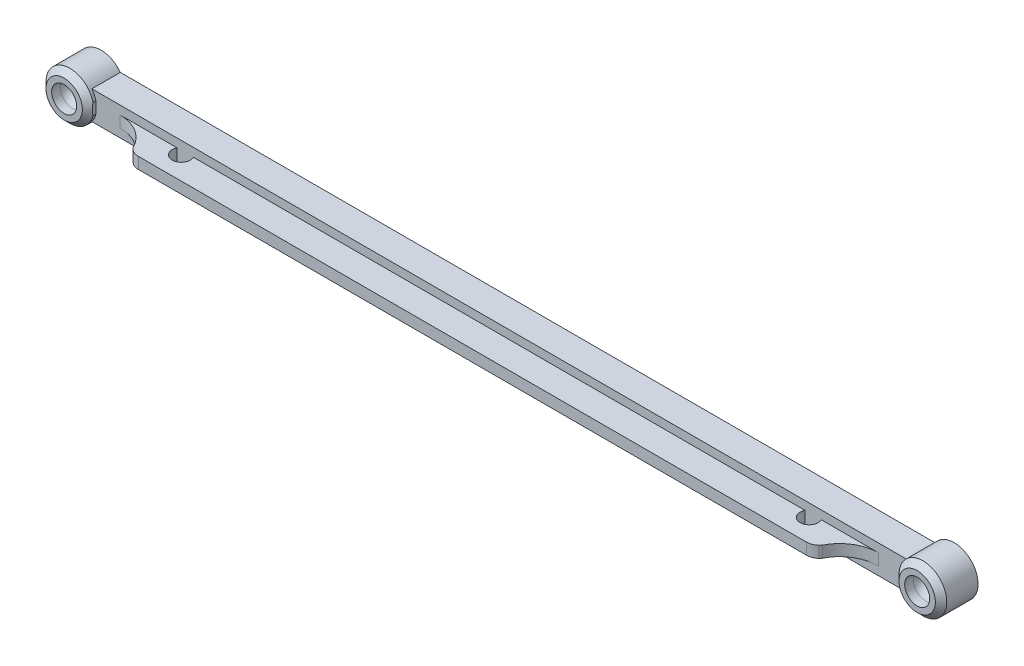
ISO-10303-21;
HEADER;
FILE_DESCRIPTION(('STEP AP214'),'2;1');
FILE_NAME('part.step','',(''),(''),'','','');
FILE_SCHEMA(('AUTOMOTIVE_DESIGN { 1 0 10303 214 1 1 1 1 }'));
ENDSEC;
DATA;
#1=APPLICATION_CONTEXT('core data for automotive mechanical design processes');
#2=APPLICATION_PROTOCOL_DEFINITION('international standard','automotive_design',2000,#1);
#3=PRODUCT_CONTEXT('',#1,'mechanical');
#4=PRODUCT('Part','Part','',(#3));
#5=PRODUCT_RELATED_PRODUCT_CATEGORY('part','',(#4));
#6=PRODUCT_DEFINITION_FORMATION('','',#4);
#7=PRODUCT_DEFINITION_CONTEXT('part definition',#1,'design');
#8=PRODUCT_DEFINITION('design','',#6,#7);
#9=PRODUCT_DEFINITION_SHAPE('','',#8);
#10=(LENGTH_UNIT() NAMED_UNIT(*) SI_UNIT(.MILLI.,.METRE.));
#11=(NAMED_UNIT(*) PLANE_ANGLE_UNIT() SI_UNIT($,.RADIAN.));
#12=(NAMED_UNIT(*) SI_UNIT($,.STERADIAN.) SOLID_ANGLE_UNIT());
#13=UNCERTAINTY_MEASURE_WITH_UNIT(LENGTH_MEASURE(1.E-05),#10,'distance_accuracy_value','');
#14=(GEOMETRIC_REPRESENTATION_CONTEXT(3) GLOBAL_UNCERTAINTY_ASSIGNED_CONTEXT((#13)) GLOBAL_UNIT_ASSIGNED_CONTEXT((#10,
#11,#12)) REPRESENTATION_CONTEXT('',''));
#15=CARTESIAN_POINT('',(0.,0.,0.));
#16=DIRECTION('',(0.,0.,1.));
#17=DIRECTION('',(1.,0.,0.));
#18=AXIS2_PLACEMENT_3D('',#15,#16,#17);
#19=CARTESIAN_POINT('',(154.201,3.5,5.));
#20=DIRECTION('',(0.,-1.,0.));
#21=DIRECTION('',(0.,0.,-1.));
#22=AXIS2_PLACEMENT_3D('',#19,#20,#21);
#23=PLANE('',#22);
#24=DIRECTION('',(-1.,0.,0.));
#25=VECTOR('',#24,1.);
#26=CARTESIAN_POINT('',(154.201,3.5,5.));
#27=LINE('',#26,#25);
#28=CARTESIAN_POINT('',(141.68959214773,3.5,5.));
#29=VERTEX_POINT('',#28);
#30=CARTESIAN_POINT('',(131.644,3.5,5.));
#31=VERTEX_POINT('',#30);
#32=EDGE_CURVE('E214',#29,#31,#27,.T.);
#33=ORIENTED_EDGE('',*,*,#32,.T.);
#34=CARTESIAN_POINT('',(130.2055,3.5,5.70051249096644));
#35=DIRECTION('',(0.,-1.,0.));
#36=DIRECTION('',(0.,0.,-1.));
#37=AXIS2_PLACEMENT_3D('',#34,#35,#36);
#38=CIRCLE('',#37,1.60000000000001);
#39=CARTESIAN_POINT('',(128.767,3.5,5.));
#40=VERTEX_POINT('',#39);
#41=EDGE_CURVE('E176',#31,#40,#38,.T.);
#42=ORIENTED_EDGE('',*,*,#41,.T.);
#43=CARTESIAN_POINT('',(21.233,3.5,5.));
#44=VERTEX_POINT('',#43);
#45=EDGE_CURVE('E238',#40,#44,#27,.T.);
#46=ORIENTED_EDGE('',*,*,#45,.T.);
#47=CARTESIAN_POINT('',(19.7945,3.5,5.70051249096644));
#48=DIRECTION('',(0.,-1.,0.));
#49=DIRECTION('',(0.,0.,-1.));
#50=AXIS2_PLACEMENT_3D('',#47,#48,#49);
#51=CIRCLE('',#50,1.6);
#52=CARTESIAN_POINT('',(18.356,3.5,5.));
#53=VERTEX_POINT('',#52);
#54=EDGE_CURVE('E444',#53,#44,#51,.F.);
#55=ORIENTED_EDGE('',*,*,#54,.F.);
#56=CARTESIAN_POINT('',(8.3104078522698,3.5,5.));
#57=VERTEX_POINT('',#56);
#58=EDGE_CURVE('E239',#53,#57,#27,.T.);
#59=ORIENTED_EDGE('',*,*,#58,.T.);
#60=CARTESIAN_POINT('',(8.3104078522698,3.5,11.8208559757819));
#61=DIRECTION('',(0.,-1.,0.));
#62=DIRECTION('',(0.,0.,-1.));
#63=AXIS2_PLACEMENT_3D('',#60,#61,#62);
#64=CIRCLE('',#63,6.82085597578193);
#65=CARTESIAN_POINT('',(14.4321261282648,3.5,8.81275996805392));
#66=VERTEX_POINT('',#65);
#67=EDGE_CURVE('E296',#57,#66,#64,.T.);
#68=ORIENTED_EDGE('',*,*,#67,.T.);
#69=DIRECTION('',(-0.678416162135093,0.,-0.734677827999383));
#70=VECTOR('',#69,1.);
#71=CARTESIAN_POINT('',(76.8601935670094,3.49999999999999,76.4180434974916));
#72=LINE('',#71,#70);
#73=CARTESIAN_POINT('',(14.6695717850121,3.5,9.06989720785372));
#74=VERTEX_POINT('',#73);
#75=EDGE_CURVE('E294',#74,#66,#72,.T.);
#76=ORIENTED_EDGE('',*,*,#75,.F.);
#77=CARTESIAN_POINT('',(16.27,3.5,7.35244652390528));
#78=DIRECTION('',(0.,-1.,0.));
#79=DIRECTION('',(0.,0.,-1.));
#80=AXIS2_PLACEMENT_3D('',#77,#78,#79);
#81=CIRCLE('',#80,2.34755347609473);
#82=CARTESIAN_POINT('',(16.27,3.5,9.7));
#83=VERTEX_POINT('',#82);
#84=EDGE_CURVE('E292',#83,#74,#81,.T.);
#85=ORIENTED_EDGE('',*,*,#84,.F.);
#86=DIRECTION('',(-1.,0.,0.));
#87=VECTOR('',#86,1.);
#88=CARTESIAN_POINT('',(154.201,3.5,9.7));
#89=LINE('',#88,#87);
#90=CARTESIAN_POINT('',(133.73,3.5,9.7));
#91=VERTEX_POINT('',#90);
#92=EDGE_CURVE('E208',#91,#83,#89,.T.);
#93=ORIENTED_EDGE('',*,*,#92,.F.);
#94=CARTESIAN_POINT('',(133.73,3.5,7.35244652390528));
#95=DIRECTION('',(0.,-1.,0.));
#96=DIRECTION('',(0.,0.,-1.));
#97=AXIS2_PLACEMENT_3D('',#94,#95,#96);
#98=CIRCLE('',#97,2.34755347609473);
#99=CARTESIAN_POINT('',(135.330428214988,3.5,9.06989720785372));
#100=VERTEX_POINT('',#99);
#101=EDGE_CURVE('E426',#91,#100,#98,.F.);
#102=ORIENTED_EDGE('',*,*,#101,.T.);
#103=DIRECTION('',(0.678416162135093,0.,-0.734677827999383));
#104=VECTOR('',#103,1.);
#105=CARTESIAN_POINT('',(146.044087594872,3.5,-2.53225563350403));
#106=LINE('',#105,#104);
#107=CARTESIAN_POINT('',(135.567873871735,3.5,8.81275996805392));
#108=VERTEX_POINT('',#107);
#109=EDGE_CURVE('E419',#100,#108,#106,.T.);
#110=ORIENTED_EDGE('',*,*,#109,.T.);
#111=CARTESIAN_POINT('',(141.68959214773,3.5,11.8208559757819));
#112=DIRECTION('',(0.,-1.,0.));
#113=DIRECTION('',(0.,0.,-1.));
#114=AXIS2_PLACEMENT_3D('',#111,#112,#113);
#115=CIRCLE('',#114,6.82085597578194);
#116=EDGE_CURVE('E424',#29,#108,#115,.F.);
#117=ORIENTED_EDGE('',*,*,#116,.F.);
#118=EDGE_LOOP('',(#33,#42,#46,#55,#59,#68,#76,#85,#93,#102,#110,#117));
#119=FACE_BOUND('',#118,.T.);
#120=ADVANCED_FACE('F35',(#119),#23,.F.);
#121=CARTESIAN_POINT('',(154.201,1.5,5.));
#122=DIRECTION('',(0.,1.,0.));
#123=DIRECTION('',(0.,0.,1.));
#124=AXIS2_PLACEMENT_3D('',#121,#122,#123);
#125=PLANE('',#124);
#126=DIRECTION('',(-1.,0.,0.));
#127=VECTOR('',#126,1.);
#128=CARTESIAN_POINT('',(154.201,1.5,5.));
#129=LINE('',#128,#127);
#130=CARTESIAN_POINT('',(128.767,1.5,5.));
#131=VERTEX_POINT('',#130);
#132=CARTESIAN_POINT('',(21.233,1.5,5.));
#133=VERTEX_POINT('',#132);
#134=EDGE_CURVE('E189',#131,#133,#129,.T.);
#135=ORIENTED_EDGE('',*,*,#134,.F.);
#136=CARTESIAN_POINT('',(130.2055,1.5,5.70051249096644));
#137=DIRECTION('',(0.,-1.,0.));
#138=DIRECTION('',(0.,0.,-1.));
#139=AXIS2_PLACEMENT_3D('',#136,#137,#138);
#140=CIRCLE('',#139,1.60000000000001);
#141=CARTESIAN_POINT('',(131.644,1.5,5.));
#142=VERTEX_POINT('',#141);
#143=EDGE_CURVE('E50',#142,#131,#140,.T.);
#144=ORIENTED_EDGE('',*,*,#143,.F.);
#145=CARTESIAN_POINT('',(141.68959214773,1.5,5.));
#146=VERTEX_POINT('',#145);
#147=EDGE_CURVE('E187',#146,#142,#129,.T.);
#148=ORIENTED_EDGE('',*,*,#147,.F.);
#149=CARTESIAN_POINT('',(141.68959214773,1.5,11.8208559757819));
#150=DIRECTION('',(0.,-1.,0.));
#151=DIRECTION('',(0.,0.,-1.));
#152=AXIS2_PLACEMENT_3D('',#149,#150,#151);
#153=CIRCLE('',#152,6.82085597578194);
#154=CARTESIAN_POINT('',(135.567873871735,1.5,8.81275996805392));
#155=VERTEX_POINT('',#154);
#156=EDGE_CURVE('E442',#146,#155,#153,.F.);
#157=ORIENTED_EDGE('',*,*,#156,.T.);
#158=DIRECTION('',(0.678416162135093,0.,-0.734677827999383));
#159=VECTOR('',#158,1.);
#160=CARTESIAN_POINT('',(77.5653968978587,1.49999999999999,71.6254348130059));
#161=LINE('',#160,#159);
#162=CARTESIAN_POINT('',(135.330428214988,1.5,9.06989720785371));
#163=VERTEX_POINT('',#162);
#164=EDGE_CURVE('E432',#163,#155,#161,.T.);
#165=ORIENTED_EDGE('',*,*,#164,.F.);
#166=CARTESIAN_POINT('',(133.73,1.5,7.35244652390528));
#167=DIRECTION('',(0.,-1.,0.));
#168=DIRECTION('',(0.,0.,-1.));
#169=AXIS2_PLACEMENT_3D('',#166,#167,#168);
#170=CIRCLE('',#169,2.34755347609473);
#171=CARTESIAN_POINT('',(133.73,1.5,9.7));
#172=VERTEX_POINT('',#171);
#173=EDGE_CURVE('E439',#172,#163,#170,.F.);
#174=ORIENTED_EDGE('',*,*,#173,.F.);
#175=DIRECTION('',(-1.,0.,0.));
#176=VECTOR('',#175,1.);
#177=CARTESIAN_POINT('',(154.201,1.5,9.7));
#178=LINE('',#177,#176);
#179=CARTESIAN_POINT('',(16.27,1.5,9.7));
#180=VERTEX_POINT('',#179);
#181=EDGE_CURVE('E203',#172,#180,#178,.T.);
#182=ORIENTED_EDGE('',*,*,#181,.T.);
#183=CARTESIAN_POINT('',(16.27,1.5,7.35244652390528));
#184=DIRECTION('',(0.,-1.,0.));
#185=DIRECTION('',(0.,0.,-1.));
#186=AXIS2_PLACEMENT_3D('',#183,#184,#185);
#187=CIRCLE('',#186,2.34755347609473);
#188=CARTESIAN_POINT('',(14.6695717850121,1.5,9.06989720785372));
#189=VERTEX_POINT('',#188);
#190=EDGE_CURVE('E406',#180,#189,#187,.T.);
#191=ORIENTED_EDGE('',*,*,#190,.T.);
#192=DIRECTION('',(-0.678416162135093,0.,-0.734677827999383));
#193=VECTOR('',#192,1.);
#194=CARTESIAN_POINT('',(3.39732974522494,1.5,-3.13716205855723));
#195=LINE('',#194,#193);
#196=CARTESIAN_POINT('',(14.4321261282648,1.5,8.81275996805392));
#197=VERTEX_POINT('',#196);
#198=EDGE_CURVE('E416',#189,#197,#195,.T.);
#199=ORIENTED_EDGE('',*,*,#198,.T.);
#200=CARTESIAN_POINT('',(8.3104078522698,1.5,11.8208559757819));
#201=DIRECTION('',(0.,-1.,0.));
#202=DIRECTION('',(0.,0.,-1.));
#203=AXIS2_PLACEMENT_3D('',#200,#201,#202);
#204=CIRCLE('',#203,6.82085597578193);
#205=CARTESIAN_POINT('',(8.3104078522698,1.5,5.));
#206=VERTEX_POINT('',#205);
#207=EDGE_CURVE('E418',#206,#197,#204,.T.);
#208=ORIENTED_EDGE('',*,*,#207,.F.);
#209=CARTESIAN_POINT('',(18.356,1.5,5.));
#210=VERTEX_POINT('',#209);
#211=EDGE_CURVE('E197',#210,#206,#129,.T.);
#212=ORIENTED_EDGE('',*,*,#211,.F.);
#213=CARTESIAN_POINT('',(19.7945,1.5,5.70051249096644));
#214=DIRECTION('',(0.,-1.,0.));
#215=DIRECTION('',(0.,0.,-1.));
#216=AXIS2_PLACEMENT_3D('',#213,#214,#215);
#217=CIRCLE('',#216,1.6);
#218=EDGE_CURVE('E450',#210,#133,#217,.F.);
#219=ORIENTED_EDGE('',*,*,#218,.T.);
#220=EDGE_LOOP('',(#135,#144,#148,#157,#165,#174,#182,#191,#199,#208,#212,#219));
#221=FACE_BOUND('',#220,.T.);
#222=ADVANCED_FACE('F185',(#221),#125,.F.);
#223=CARTESIAN_POINT('',(0.,2.5,-8.96135265700483));
#224=DIRECTION('',(0.,0.,-1.));
#225=DIRECTION('',(0.,1.,0.));
#226=AXIS2_PLACEMENT_3D('',#223,#224,#225);
#227=CYLINDRICAL_SURFACE('',#226,4.2);
#228=CARTESIAN_POINT('',(0.,2.5,5.));
#229=DIRECTION('',(0.,0.,1.));
#230=DIRECTION('',(1.,0.,0.));
#231=AXIS2_PLACEMENT_3D('',#228,#229,#230);
#232=CIRCLE('',#231,4.2);
#233=CARTESIAN_POINT('',(4.07921561087424,3.5,5.));
#234=VERTEX_POINT('',#233);
#235=CARTESIAN_POINT('',(3.37490740613724,5.,5.));
#236=VERTEX_POINT('',#235);
#237=EDGE_CURVE('E276',#234,#236,#232,.T.);
#238=ORIENTED_EDGE('',*,*,#237,.T.);
#239=DIRECTION('',(0.,0.,-1.));
#240=VECTOR('',#239,1.);
#241=CARTESIAN_POINT('',(3.37490740613724,5.,-8.96135265700483));
#242=LINE('',#241,#240);
#243=CARTESIAN_POINT('',(3.37490740613724,5.,0.));
#244=VERTEX_POINT('',#243);
#245=EDGE_CURVE('E260',#236,#244,#242,.T.);
#246=ORIENTED_EDGE('',*,*,#245,.T.);
#247=CARTESIAN_POINT('',(0.,2.5,0.));
#248=DIRECTION('',(0.,0.,-1.));
#249=DIRECTION('',(0.,1.,0.));
#250=AXIS2_PLACEMENT_3D('',#247,#248,#249);
#251=CIRCLE('',#250,4.2);
#252=CARTESIAN_POINT('',(3.37490740613724,0.,0.));
#253=VERTEX_POINT('',#252);
#254=EDGE_CURVE('E355',#253,#244,#251,.T.);
#255=ORIENTED_EDGE('',*,*,#254,.F.);
#256=DIRECTION('',(0.,0.,-1.));
#257=VECTOR('',#256,1.);
#258=CARTESIAN_POINT('',(3.37490740613724,0.,-8.96135265700483));
#259=LINE('',#258,#257);
#260=CARTESIAN_POINT('',(3.37490740613724,0.,5.));
#261=VERTEX_POINT('',#260);
#262=EDGE_CURVE('E264',#253,#261,#259,.F.);
#263=ORIENTED_EDGE('',*,*,#262,.T.);
#264=CARTESIAN_POINT('',(0.,2.5,5.));
#265=DIRECTION('',(0.,0.,1.));
#266=DIRECTION('',(1.,0.,0.));
#267=AXIS2_PLACEMENT_3D('',#264,#265,#266);
#268=CIRCLE('',#267,4.2);
#269=CARTESIAN_POINT('',(4.07921561087423,1.5,5.));
#270=VERTEX_POINT('',#269);
#271=EDGE_CURVE('E266',#261,#270,#268,.T.);
#272=ORIENTED_EDGE('',*,*,#271,.T.);
#273=DIRECTION('',(0.,0.,-1.));
#274=VECTOR('',#273,1.);
#275=CARTESIAN_POINT('',(4.07921561087423,1.5,-8.96135265700483));
#276=LINE('',#275,#274);
#277=CARTESIAN_POINT('',(4.07921561087423,1.5,5.5));
#278=VERTEX_POINT('',#277);
#279=EDGE_CURVE('E270',#270,#278,#276,.F.);
#280=ORIENTED_EDGE('',*,*,#279,.T.);
#281=CARTESIAN_POINT('',(0.,2.5,5.5));
#282=DIRECTION('',(0.,0.,-1.));
#283=DIRECTION('',(0.,1.,0.));
#284=AXIS2_PLACEMENT_3D('',#281,#282,#283);
#285=CIRCLE('',#284,4.2);
#286=CARTESIAN_POINT('',(4.07921561087423,3.5,5.5));
#287=VERTEX_POINT('',#286);
#288=EDGE_CURVE('E358',#278,#287,#285,.T.);
#289=ORIENTED_EDGE('',*,*,#288,.T.);
#290=DIRECTION('',(0.,0.,-1.));
#291=VECTOR('',#290,1.);
#292=CARTESIAN_POINT('',(4.07921561087423,3.5,-8.96135265700483));
#293=LINE('',#292,#291);
#294=EDGE_CURVE('E273',#287,#234,#293,.T.);
#295=ORIENTED_EDGE('',*,*,#294,.T.);
#296=EDGE_LOOP('',(#238,#246,#255,#263,#272,#280,#289,#295));
#297=FACE_BOUND('',#296,.T.);
#298=ADVANCED_FACE('F321',(#297),#227,.T.);
#299=CARTESIAN_POINT('',(0.,2.5,-8.96135265700483));
#300=DIRECTION('',(0.,0.,-1.));
#301=DIRECTION('',(0.,1.,0.));
#302=AXIS2_PLACEMENT_3D('',#299,#300,#301);
#303=CYLINDRICAL_SURFACE('',#302,2.19806157482775);
#304=CARTESIAN_POINT('',(0.,2.5,5.00019123699589));
#305=DIRECTION('',(0.,0.,-1.));
#306=DIRECTION('',(0.,1.,0.));
#307=AXIS2_PLACEMENT_3D('',#304,#305,#306);
#308=CIRCLE('',#307,2.19806157482775);
#309=CARTESIAN_POINT('',(0.,4.69806157482775,5.00019123699589));
#310=VERTEX_POINT('',#309);
#311=EDGE_CURVE('E357',#310,#310,#308,.T.);
#312=ORIENTED_EDGE('',*,*,#311,.T.);
#313=EDGE_LOOP('',(#312));
#314=FACE_BOUND('',#313,.T.);
#315=CARTESIAN_POINT('',(0.,2.5,6.50019123699589));
#316=DIRECTION('',(0.,0.,-1.));
#317=DIRECTION('',(0.,1.,0.));
#318=AXIS2_PLACEMENT_3D('',#315,#316,#317);
#319=CIRCLE('',#318,2.19806157482775);
#320=CARTESIAN_POINT('',(0.,4.69806157482775,6.50019123699589));
#321=VERTEX_POINT('',#320);
#322=EDGE_CURVE('E219',#321,#321,#319,.T.);
#323=ORIENTED_EDGE('',*,*,#322,.F.);
#324=EDGE_LOOP('',(#323));
#325=FACE_BOUND('',#324,.T.);
#326=ADVANCED_FACE('F37',(#314,#325),#303,.F.);
#327=CARTESIAN_POINT('',(0.,2.69806157482775,5.00019123699589));
#328=DIRECTION('',(-1.,0.,0.));
#329=DIRECTION('',(0.,1.,0.));
#330=AXIS2_PLACEMENT_3D('',#327,#328,#329);
#331=CIRCLE('',#330,2.);
#332=TRIMMED_CURVE('',#331,(PARAMETER_VALUE(-1.66998970017979)),
(PARAMETER_VALUE(1.66998970017979)),.T.,.PARAMETER.);
#333=CARTESIAN_POINT('',(0.,2.5,5.00019123699589));
#334=DIRECTION('',(0.,0.,-1.));
#335=AXIS1_PLACEMENT('',#333,#334);
#336=SURFACE_OF_REVOLUTION('',#332,#335);
#337=CARTESIAN_POINT('',(0.,2.5,3.01002249727135));
#338=VERTEX_POINT('',#337);
#339=VERTEX_LOOP('',#338);
#340=FACE_BOUND('',#339,.T.);
#341=ORIENTED_EDGE('',*,*,#311,.F.);
#342=EDGE_LOOP('',(#341));
#343=FACE_BOUND('',#342,.T.);
#344=ADVANCED_FACE('F326',(#340,#343),#336,.F.);
#345=CARTESIAN_POINT('',(0.,0.,0.));
#346=DIRECTION('',(0.,0.,-1.));
#347=DIRECTION('',(0.,1.,0.));
#348=AXIS2_PLACEMENT_3D('',#345,#346,#347);
#349=PLANE('',#348);
#350=ORIENTED_EDGE('',*,*,#254,.T.);
#351=DIRECTION('',(-1.,0.,0.));
#352=VECTOR('',#351,1.);
#353=CARTESIAN_POINT('',(154.201,5.,0.));
#354=LINE('',#353,#352);
#355=CARTESIAN_POINT('',(146.625092593863,5.,0.));
#356=VERTEX_POINT('',#355);
#357=EDGE_CURVE('E246',#356,#244,#354,.T.);
#358=ORIENTED_EDGE('',*,*,#357,.F.);
#359=CARTESIAN_POINT('',(150.,2.5,0.));
#360=DIRECTION('',(0.,0.,1.));
#361=DIRECTION('',(0.,-1.,0.));
#362=AXIS2_PLACEMENT_3D('',#359,#360,#361);
#363=CIRCLE('',#362,4.2);
#364=CARTESIAN_POINT('',(146.625092593863,0.,0.));
#365=VERTEX_POINT('',#364);
#366=EDGE_CURVE('E267',#365,#356,#363,.T.);
#367=ORIENTED_EDGE('',*,*,#366,.F.);
#368=DIRECTION('',(-1.,0.,0.));
#369=VECTOR('',#368,1.);
#370=CARTESIAN_POINT('',(154.201,0.,0.));
#371=LINE('',#370,#369);
#372=EDGE_CURVE('E253',#365,#253,#371,.T.);
#373=ORIENTED_EDGE('',*,*,#372,.T.);
#374=EDGE_LOOP('',(#350,#358,#367,#373));
#375=FACE_BOUND('',#374,.T.);
#376=ADVANCED_FACE('F318',(#375),#349,.T.);
#377=CARTESIAN_POINT('',(0.,2.5,5.5));
#378=DIRECTION('',(0.,0.,-1.));
#379=DIRECTION('',(0.,1.,0.));
#380=AXIS2_PLACEMENT_3D('',#377,#378,#379);
#381=CONICAL_SURFACE('',#380,4.2,0.786270828023447);
#382=CARTESIAN_POINT('',(4.07921561087423,-3.05824347171728,2.81020301675024));
#383=CARTESIAN_POINT('',(4.07921561087423,-2.94902247213543,2.89809174464197));
#384=CARTESIAN_POINT('',(4.07921561087423,-2.83936570169014,2.98544380436149));
#385=CARTESIAN_POINT('',(4.07921561087423,-2.61903618797947,3.1588697176517));
#386=CARTESIAN_POINT('',(4.07921561087423,-2.50836338536596,3.24494349577719));
#387=CARTESIAN_POINT('',(4.07921561087423,-2.28561065350704,3.41579665627886));
#388=CARTESIAN_POINT('',(4.07921561087423,-2.17352804386506,3.50057255043508));
#389=CARTESIAN_POINT('',(4.07921561087423,-1.94803999045359,3.66835023887016));
#390=CARTESIAN_POINT('',(4.07921561087423,-1.83463454105544,3.75135202559595));
#391=CARTESIAN_POINT('',(4.07921561087423,-1.60219359688713,3.91819463238795));
#392=CARTESIAN_POINT('',(4.07921561087423,-1.48310240936162,4.00195805610682));
#393=CARTESIAN_POINT('',(4.07921561087423,-1.24303790853613,4.16674092201757));
#394=CARTESIAN_POINT('',(4.07921561087423,-1.12206466570331,4.24776046658553));
#395=CARTESIAN_POINT('',(4.07921561087423,-0.878036545449989,4.40638776799728));
#396=CARTESIAN_POINT('',(4.07921561087423,-0.754983490760295,4.48399831751112));
#397=CARTESIAN_POINT('',(4.07921561087423,-0.50637944716625,4.6350924032192));
#398=CARTESIAN_POINT('',(4.07921561087423,-0.380828747896212,4.70857641420456));
#399=CARTESIAN_POINT('',(4.07921561087423,-0.105720270103093,4.86224135070337));
#400=CARTESIAN_POINT('',(4.07921561087423,0.044356309837633,4.94150233831024));
#401=CARTESIAN_POINT('',(4.07921561087423,0.348913629477584,5.09098492640461));
#402=CARTESIAN_POINT('',(4.07921561087423,0.503392341173609,5.16121060966018));
#403=CARTESIAN_POINT('',(4.07921561087423,0.815683009657135,5.28937460317623));
#404=CARTESIAN_POINT('',(4.07921561087423,0.973448286179693,5.34742517019001));
#405=CARTESIAN_POINT('',(4.07921561087423,1.2935512199672,5.44890298214947));
#406=CARTESIAN_POINT('',(4.07921561087423,1.45588352220481,5.49234663847034));
#407=CARTESIAN_POINT('',(4.07921561087423,1.71290680143391,5.54645540039223));
#408=CARTESIAN_POINT('',(4.07921561087423,1.80634280196187,5.56316115751603));
#409=CARTESIAN_POINT('',(4.07921561087423,1.99424429364494,5.59044467828207));
#410=CARTESIAN_POINT('',(4.07921561087423,2.08871097702319,5.60101435460804));
#411=CARTESIAN_POINT('',(4.07921561087423,2.28438864898174,5.61612712874443));
#412=CARTESIAN_POINT('',(4.07921561087423,2.38563433378584,5.62022782048516));
#413=CARTESIAN_POINT('',(4.07921561087423,2.58817021377162,5.620877726947));
#414=CARTESIAN_POINT('',(4.07921561087423,2.68946041383157,5.61742536951819));
#415=CARTESIAN_POINT('',(4.07921561087423,2.89148196879183,5.60310057614086));
#416=CARTESIAN_POINT('',(4.07921561087423,2.99221347409462,5.59223024570202));
#417=CARTESIAN_POINT('',(4.07921561087423,3.19266038729954,5.56347410400537));
#418=CARTESIAN_POINT('',(4.07921561087423,3.29237571819317,5.54558776505216));
#419=CARTESIAN_POINT('',(4.07921561087423,3.55509068578622,5.48959324544994));
#420=CARTESIAN_POINT('',(4.07921561087423,3.71691327927505,5.44590626379638));
#421=CARTESIAN_POINT('',(4.07921561087423,4.03595348117547,5.34410195774859));
#422=CARTESIAN_POINT('',(4.07921561087423,4.19316751995585,5.28597376149825));
#423=CARTESIAN_POINT('',(4.07921561087423,4.50486319845032,5.15757522710916));
#424=CARTESIAN_POINT('',(4.07921561087423,4.65928402265134,5.08715886268126));
#425=CARTESIAN_POINT('',(4.07921561087423,4.8875213641848,4.97483129047697));
#426=CARTESIAN_POINT('',(4.07921561087423,4.96302470078855,4.93627734565101));
#427=CARTESIAN_POINT('',(4.07921561087423,5.11298755287114,4.85719352408329));
#428=CARTESIAN_POINT('',(4.07921561087423,5.18744710601416,4.81666371887659));
#429=CARTESIAN_POINT('',(4.07921561087423,5.41314813499236,4.69036484833745));
#430=CARTESIAN_POINT('',(4.07921561087423,5.56283782582697,4.60181933006953));
#431=CARTESIAN_POINT('',(4.07921561087423,5.8587612305139,4.41910756950373));
#432=CARTESIAN_POINT('',(4.07921561087423,6.00499412119261,4.32494000687117));
#433=CARTESIAN_POINT('',(4.07921561087423,6.29464422115331,4.13214077941812));
#434=CARTESIAN_POINT('',(4.07921561087423,6.43805909255832,4.03350561526429));
#435=CARTESIAN_POINT('',(4.07921561087423,6.72243303280646,3.8327471316024));
#436=CARTESIAN_POINT('',(4.07921561087423,6.86339191016466,3.7306235419359));
#437=CARTESIAN_POINT('',(4.07921561087423,7.14377956078175,3.52317853372754));
#438=CARTESIAN_POINT('',(4.07921561087423,7.28320026446812,3.41784623519842));
#439=CARTESIAN_POINT('',(4.07921561087423,7.56027840901406,3.20488440080703));
#440=CARTESIAN_POINT('',(4.07921561087423,7.69793579190453,3.09725478972927));
#441=CARTESIAN_POINT('',(4.07921561087423,8.10869994876857,2.77153448105253));
#442=CARTESIAN_POINT('',(4.07921561087423,8.37957625099633,2.55062915186335));
#443=CARTESIAN_POINT('',(4.07921561087423,8.76924944383297,2.22647468059788));
#444=CARTESIAN_POINT('',(4.07921561087423,8.88979169506179,2.12530261290222));
#445=CARTESIAN_POINT('',(4.07921561087423,9.13008593212839,1.92203829497464));
#446=CARTESIAN_POINT('',(4.07921561087423,9.24983796856816,1.81994610467364));
#447=CARTESIAN_POINT('',(4.07921561087423,9.60810332326594,1.51244073661291));
#448=CARTESIAN_POINT('',(4.07921561087423,9.8455885369293,1.30582996247136));
#449=CARTESIAN_POINT('',(4.07921561087423,10.3162820154473,0.892045722801224));
#450=CARTESIAN_POINT('',(4.07921561087423,10.5495095365363,0.68489410145335));
#451=CARTESIAN_POINT('',(4.07921561087423,11.0142104438724,0.268722528555917));
#452=CARTESIAN_POINT('',(4.07921561087423,11.2456841649387,0.0597029511200272));
#453=CARTESIAN_POINT('',(4.07921561087423,11.4765036467225,-0.150029700547989));
#454=B_SPLINE_CURVE_WITH_KNOTS('',3,(#382,#383,#384,#385,#386,#387,#388,#389,#390,#391,#392,
#393,#394,#395,#396,#397,#398,#399,#400,#401,#402,#403,#404,#405,#406,#407,#408,#409,#410,#411,
#412,#413,#414,#415,#416,#417,#418,#419,#420,#421,#422,#423,#424,#425,#426,#427,#428,#429,#430,
#431,#432,#433,#434,#435,#436,#437,#438,#439,#440,#441,#442,#443,#444,#445,#446,#447,#448,#449,
#450,#451,#452,#453),.UNSPECIFIED.,.F.,.F.,(4,2,2,2,2,2,2,2,2,2,2,2,2,2,2,2,2,2,2,2,2,2,2,2,2,2,
2,2,2,2,2,2,2,2,2,4),(0.,0.420577320339265,0.841179365619351,1.26276265182371,1.68434773251586,
2.12111243897109,2.55786083143007,2.99424449683801,3.43057784952075,3.93950745545786,
4.44820627844611,4.9519857705074,5.45519734238093,5.73977461421823,6.02472611055548,
6.32843103828481,6.63219918751506,6.93588115135633,7.23958596042594,7.74152913533529,
8.24385134198777,8.75260943072418,9.00691869015387,9.26121874927018,9.78279291914568,
10.304490066042,10.8266031579342,11.3487567765576,11.8729384834476,12.3971373787907,
13.4456194083063,13.9177366539332,14.3898233679441,15.3341427841417,16.2699535192906,
17.2055808532896),.UNSPECIFIED.);
#455=EDGE_CURVE('E298',#287,#278,#454,.F.);
#456=ORIENTED_EDGE('',*,*,#455,.F.);
#457=ORIENTED_EDGE('',*,*,#288,.F.);
#458=EDGE_LOOP('',(#456,#457));
#459=FACE_BOUND('',#458,.T.);
#460=CARTESIAN_POINT('',(0.,2.5,6.50019123699589));
#461=DIRECTION('',(0.,0.,-1.));
#462=DIRECTION('',(0.,1.,0.));
#463=AXIS2_PLACEMENT_3D('',#460,#461,#462);
#464=CIRCLE('',#463,3.19806157482775);
#465=CARTESIAN_POINT('',(0.,5.69806157482775,6.50019123699589));
#466=VERTEX_POINT('',#465);
#467=EDGE_CURVE('E225',#466,#466,#464,.T.);
#468=ORIENTED_EDGE('',*,*,#467,.T.);
#469=EDGE_LOOP('',(#468));
#470=FACE_BOUND('',#469,.T.);
#471=ADVANCED_FACE('F312',(#459,#470),#381,.T.);
#472=CARTESIAN_POINT('',(0.,0.,6.50019123699589));
#473=DIRECTION('',(0.,0.,1.));
#474=DIRECTION('',(0.,-1.,0.));
#475=AXIS2_PLACEMENT_3D('',#472,#473,#474);
#476=PLANE('',#475);
#477=ORIENTED_EDGE('',*,*,#322,.T.);
#478=EDGE_LOOP('',(#477));
#479=FACE_BOUND('',#478,.T.);
#480=ORIENTED_EDGE('',*,*,#467,.F.);
#481=EDGE_LOOP('',(#480));
#482=FACE_BOUND('',#481,.T.);
#483=ADVANCED_FACE('F317',(#479,#482),#476,.T.);
#484=CARTESIAN_POINT('',(154.201,5.,0.));
#485=DIRECTION('',(0.,-1.,0.));
#486=DIRECTION('',(0.,0.,-1.));
#487=AXIS2_PLACEMENT_3D('',#484,#485,#486);
#488=PLANE('',#487);
#489=DIRECTION('',(0.,0.,1.));
#490=VECTOR('',#489,1.);
#491=CARTESIAN_POINT('',(146.625092593863,5.,3.01002249727135));
#492=LINE('',#491,#490);
#493=CARTESIAN_POINT('',(146.625092593863,5.,5.));
#494=VERTEX_POINT('',#493);
#495=EDGE_CURVE('E233',#356,#494,#492,.T.);
#496=ORIENTED_EDGE('',*,*,#495,.F.);
#497=ORIENTED_EDGE('',*,*,#357,.T.);
#498=ORIENTED_EDGE('',*,*,#245,.F.);
#499=DIRECTION('',(-1.,0.,0.));
#500=VECTOR('',#499,1.);
#501=CARTESIAN_POINT('',(154.201,5.,5.));
#502=LINE('',#501,#500);
#503=EDGE_CURVE('E237',#494,#236,#502,.T.);
#504=ORIENTED_EDGE('',*,*,#503,.F.);
#505=EDGE_LOOP('',(#496,#497,#498,#504));
#506=FACE_BOUND('',#505,.T.);
#507=ADVANCED_FACE('F345',(#506),#488,.F.);
#508=CARTESIAN_POINT('',(154.201,3.5,5.));
#509=DIRECTION('',(0.,0.,-1.));
#510=DIRECTION('',(-1.,0.,0.));
#511=AXIS2_PLACEMENT_3D('',#508,#509,#510);
#512=PLANE('',#511);
#513=ORIENTED_EDGE('',*,*,#45,.F.);
#514=DIRECTION('',(0.,-1.,0.));
#515=VECTOR('',#514,1.);
#516=CARTESIAN_POINT('',(128.767,6.7,5.));
#517=LINE('',#516,#515);
#518=EDGE_CURVE('E54',#40,#131,#517,.T.);
#519=ORIENTED_EDGE('',*,*,#518,.T.);
#520=ORIENTED_EDGE('',*,*,#134,.T.);
#521=DIRECTION('',(0.,-1.,0.));
#522=VECTOR('',#521,1.);
#523=CARTESIAN_POINT('',(21.233,6.7,5.));
#524=LINE('',#523,#522);
#525=EDGE_CURVE('E447',#44,#133,#524,.T.);
#526=ORIENTED_EDGE('',*,*,#525,.F.);
#527=EDGE_LOOP('',(#513,#519,#520,#526));
#528=FACE_BOUND('',#527,.T.);
#529=DIRECTION('',(0.,-1.,0.));
#530=VECTOR('',#529,1.);
#531=CARTESIAN_POINT('',(131.644,6.7,5.));
#532=LINE('',#531,#530);
#533=EDGE_CURVE('E174',#31,#142,#532,.T.);
#534=ORIENTED_EDGE('',*,*,#533,.F.);
#535=ORIENTED_EDGE('',*,*,#32,.F.);
#536=DIRECTION('',(0.,-1.,0.));
#537=VECTOR('',#536,1.);
#538=CARTESIAN_POINT('',(141.68959214773,6.7,5.));
#539=LINE('',#538,#537);
#540=EDGE_CURVE('E193',#29,#146,#539,.T.);
#541=ORIENTED_EDGE('',*,*,#540,.T.);
#542=ORIENTED_EDGE('',*,*,#147,.T.);
#543=EDGE_LOOP('',(#534,#535,#541,#542));
#544=FACE_BOUND('',#543,.T.);
#545=ORIENTED_EDGE('',*,*,#58,.F.);
#546=DIRECTION('',(0.,-1.,0.));
#547=VECTOR('',#546,1.);
#548=CARTESIAN_POINT('',(18.356,6.7,5.));
#549=LINE('',#548,#547);
#550=EDGE_CURVE('E448',#53,#210,#549,.T.);
#551=ORIENTED_EDGE('',*,*,#550,.T.);
#552=ORIENTED_EDGE('',*,*,#211,.T.);
#553=DIRECTION('',(0.,-1.,0.));
#554=VECTOR('',#553,1.);
#555=CARTESIAN_POINT('',(8.3104078522698,6.7,5.));
#556=LINE('',#555,#554);
#557=EDGE_CURVE('E306',#57,#206,#556,.T.);
#558=ORIENTED_EDGE('',*,*,#557,.F.);
#559=EDGE_LOOP('',(#545,#551,#552,#558));
#560=FACE_BOUND('',#559,.T.);
#561=ORIENTED_EDGE('',*,*,#503,.T.);
#562=ORIENTED_EDGE('',*,*,#237,.F.);
#563=DIRECTION('',(0.,-1.,0.));
#564=VECTOR('',#563,1.);
#565=CARTESIAN_POINT('',(4.07921561087424,6.7,5.));
#566=LINE('',#565,#564);
#567=EDGE_CURVE('E305',#234,#270,#566,.T.);
#568=ORIENTED_EDGE('',*,*,#567,.T.);
#569=ORIENTED_EDGE('',*,*,#271,.F.);
#570=DIRECTION('',(-1.,0.,0.));
#571=VECTOR('',#570,1.);
#572=CARTESIAN_POINT('',(154.201,0.,5.));
#573=LINE('',#572,#571);
#574=CARTESIAN_POINT('',(146.625092593863,0.,5.));
#575=VERTEX_POINT('',#574);
#576=EDGE_CURVE('E195',#575,#261,#573,.T.);
#577=ORIENTED_EDGE('',*,*,#576,.F.);
#578=CARTESIAN_POINT('',(150.,2.5,5.));
#579=DIRECTION('',(0.,0.,-1.));
#580=DIRECTION('',(-1.,0.,0.));
#581=AXIS2_PLACEMENT_3D('',#578,#579,#580);
#582=CIRCLE('',#581,4.2);
#583=CARTESIAN_POINT('',(145.920784389126,1.5,5.));
#584=VERTEX_POINT('',#583);
#585=EDGE_CURVE('E218',#584,#575,#582,.F.);
#586=ORIENTED_EDGE('',*,*,#585,.F.);
#587=DIRECTION('',(0.,-1.,0.));
#588=VECTOR('',#587,1.);
#589=CARTESIAN_POINT('',(145.920784389126,6.7,5.));
#590=LINE('',#589,#588);
#591=CARTESIAN_POINT('',(145.920784389126,3.49999999999996,5.));
#592=VERTEX_POINT('',#591);
#593=EDGE_CURVE('E431',#592,#584,#590,.T.);
#594=ORIENTED_EDGE('',*,*,#593,.F.);
#595=CARTESIAN_POINT('',(150.,2.5,5.));
#596=DIRECTION('',(0.,0.,-1.));
#597=DIRECTION('',(-1.,0.,0.));
#598=AXIS2_PLACEMENT_3D('',#595,#596,#597);
#599=CIRCLE('',#598,4.2);
#600=EDGE_CURVE('E230',#494,#592,#599,.F.);
#601=ORIENTED_EDGE('',*,*,#600,.F.);
#602=EDGE_LOOP('',(#561,#562,#568,#569,#577,#586,#594,#601));
#603=FACE_BOUND('',#602,.T.);
#604=ADVANCED_FACE('F191',(#528,#544,#560,#603),#512,.F.);
#605=CARTESIAN_POINT('',(154.201,3.5,9.7));
#606=DIRECTION('',(0.,0.,-1.));
#607=DIRECTION('',(-1.,0.,0.));
#608=AXIS2_PLACEMENT_3D('',#605,#606,#607);
#609=PLANE('',#608);
#610=ORIENTED_EDGE('',*,*,#181,.F.);
#611=DIRECTION('',(0.,-1.,0.));
#612=VECTOR('',#611,1.);
#613=CARTESIAN_POINT('',(133.73,6.7,9.7));
#614=LINE('',#613,#612);
#615=EDGE_CURVE('E11',#172,#91,#614,.F.);
#616=ORIENTED_EDGE('',*,*,#615,.T.);
#617=ORIENTED_EDGE('',*,*,#92,.T.);
#618=DIRECTION('',(0.,-1.,0.));
#619=VECTOR('',#618,1.);
#620=CARTESIAN_POINT('',(16.27,6.7,9.7));
#621=LINE('',#620,#619);
#622=EDGE_CURVE('E400',#83,#180,#621,.T.);
#623=ORIENTED_EDGE('',*,*,#622,.T.);
#624=EDGE_LOOP('',(#610,#616,#617,#623));
#625=FACE_BOUND('',#624,.T.);
#626=ADVANCED_FACE('F343',(#625),#609,.F.);
#627=CARTESIAN_POINT('',(154.201,0.,0.));
#628=DIRECTION('',(0.,1.,0.));
#629=DIRECTION('',(0.,0.,1.));
#630=AXIS2_PLACEMENT_3D('',#627,#628,#629);
#631=PLANE('',#630);
#632=DIRECTION('',(0.,0.,1.));
#633=VECTOR('',#632,1.);
#634=CARTESIAN_POINT('',(146.625092593863,0.,3.01002249727135));
#635=LINE('',#634,#633);
#636=EDGE_CURVE('E199',#575,#365,#635,.F.);
#637=ORIENTED_EDGE('',*,*,#636,.F.);
#638=ORIENTED_EDGE('',*,*,#576,.T.);
#639=ORIENTED_EDGE('',*,*,#262,.F.);
#640=ORIENTED_EDGE('',*,*,#372,.F.);
#641=EDGE_LOOP('',(#637,#638,#639,#640));
#642=FACE_BOUND('',#641,.T.);
#643=ADVANCED_FACE('F385',(#642),#631,.F.);
#644=CARTESIAN_POINT('',(150.,2.5,3.01002249727135));
#645=DIRECTION('',(0.,0.,1.));
#646=DIRECTION('',(0.,-1.,0.));
#647=AXIS2_PLACEMENT_3D('',#644,#645,#646);
#648=CYLINDRICAL_SURFACE('',#647,4.2);
#649=ORIENTED_EDGE('',*,*,#366,.T.);
#650=ORIENTED_EDGE('',*,*,#495,.T.);
#651=ORIENTED_EDGE('',*,*,#600,.T.);
#652=DIRECTION('',(0.,0.,1.));
#653=VECTOR('',#652,1.);
#654=CARTESIAN_POINT('',(145.920784389126,3.5,3.01002249727135));
#655=LINE('',#654,#653);
#656=CARTESIAN_POINT('',(145.920784389126,3.49999999999996,5.5));
#657=VERTEX_POINT('',#656);
#658=EDGE_CURVE('E227',#592,#657,#655,.T.);
#659=ORIENTED_EDGE('',*,*,#658,.T.);
#660=CARTESIAN_POINT('',(150.,2.5,5.5));
#661=DIRECTION('',(0.,0.,1.));
#662=DIRECTION('',(0.,-1.,0.));
#663=AXIS2_PLACEMENT_3D('',#660,#661,#662);
#664=CIRCLE('',#663,4.2);
#665=CARTESIAN_POINT('',(145.920784389126,1.50000000000001,5.5));
#666=VERTEX_POINT('',#665);
#667=EDGE_CURVE('E280',#666,#657,#664,.T.);
#668=ORIENTED_EDGE('',*,*,#667,.F.);
#669=DIRECTION('',(0.,0.,1.));
#670=VECTOR('',#669,1.);
#671=CARTESIAN_POINT('',(145.920784389126,1.5,3.01002249727135));
#672=LINE('',#671,#670);
#673=EDGE_CURVE('E217',#666,#584,#672,.F.);
#674=ORIENTED_EDGE('',*,*,#673,.T.);
#675=ORIENTED_EDGE('',*,*,#585,.T.);
#676=ORIENTED_EDGE('',*,*,#636,.T.);
#677=EDGE_LOOP('',(#649,#650,#651,#659,#668,#674,#675,#676));
#678=FACE_BOUND('',#677,.T.);
#679=ADVANCED_FACE('F380',(#678),#648,.T.);
#680=CARTESIAN_POINT('',(150.,2.5,5.5));
#681=DIRECTION('',(0.,0.,-1.));
#682=DIRECTION('',(0.,1.,0.));
#683=AXIS2_PLACEMENT_3D('',#680,#681,#682);
#684=CONICAL_SURFACE('',#683,4.2,0.786270828023446);
#685=CARTESIAN_POINT('',(150.,2.5,6.50019123699589));
#686=DIRECTION('',(0.,0.,1.));
#687=DIRECTION('',(0.,-1.,0.));
#688=AXIS2_PLACEMENT_3D('',#685,#686,#687);
#689=CIRCLE('',#688,3.19806157482775);
#690=CARTESIAN_POINT('',(150.,-0.698061574827753,6.50019123699589));
#691=VERTEX_POINT('',#690);
#692=EDGE_CURVE('E283',#691,#691,#689,.T.);
#693=ORIENTED_EDGE('',*,*,#692,.F.);
#694=EDGE_LOOP('',(#693));
#695=FACE_BOUND('',#694,.T.);
#696=ORIENTED_EDGE('',*,*,#667,.T.);
#697=CARTESIAN_POINT('',(145.920784389126,-3.05824347171727,2.81020301675023));
#698=CARTESIAN_POINT('',(145.920784389126,-2.94902247213542,2.89809174464196));
#699=CARTESIAN_POINT('',(145.920784389126,-2.83936570169013,2.98544380436148));
#700=CARTESIAN_POINT('',(145.920784389126,-2.61903618797946,3.15886971765169));
#701=CARTESIAN_POINT('',(145.920784389126,-2.50836338536595,3.24494349577719));
#702=CARTESIAN_POINT('',(145.920784389126,-2.28561065350703,3.41579665627885));
#703=CARTESIAN_POINT('',(145.920784389126,-2.17352804386505,3.50057255043507));
#704=CARTESIAN_POINT('',(145.920784389126,-1.94803999045359,3.66835023887015));
#705=CARTESIAN_POINT('',(145.920784389126,-1.83463454105543,3.75135202559594));
#706=CARTESIAN_POINT('',(145.920784389126,-1.60219359688713,3.91819463238794));
#707=CARTESIAN_POINT('',(145.920784389126,-1.48310240936161,4.00195805610681));
#708=CARTESIAN_POINT('',(145.920784389126,-1.24303790853613,4.16674092201756));
#709=CARTESIAN_POINT('',(145.920784389126,-1.12206466570331,4.24776046658553));
#710=CARTESIAN_POINT('',(145.920784389126,-0.878036545449985,4.40638776799727));
#711=CARTESIAN_POINT('',(145.920784389126,-0.754983490760291,4.48399831751111));
#712=CARTESIAN_POINT('',(145.920784389126,-0.506379447166247,4.6350924032192));
#713=CARTESIAN_POINT('',(145.920784389126,-0.380828747896209,4.70857641420455));
#714=CARTESIAN_POINT('',(145.920784389126,-0.105720270103091,4.86224135070336));
#715=CARTESIAN_POINT('',(145.920784389126,0.0443563098376345,4.94150233831024));
#716=CARTESIAN_POINT('',(145.920784389126,0.348913629477586,5.0909849264046));
#717=CARTESIAN_POINT('',(145.920784389126,0.50339234117361,5.16121060966017));
#718=CARTESIAN_POINT('',(145.920784389126,0.815683009657137,5.28937460317622));
#719=CARTESIAN_POINT('',(145.920784389126,0.973448286179695,5.34742517019));
#720=CARTESIAN_POINT('',(145.920784389126,1.2935512199672,5.44890298214946));
#721=CARTESIAN_POINT('',(145.920784389126,1.45588352220481,5.49234663847033));
#722=CARTESIAN_POINT('',(145.920784389126,1.71290680143391,5.54645540039223));
#723=CARTESIAN_POINT('',(145.920784389126,1.80634280196187,5.56316115751602));
#724=CARTESIAN_POINT('',(145.920784389126,1.99424429364494,5.59044467828206));
#725=CARTESIAN_POINT('',(145.920784389126,2.08871097702319,5.60101435460803));
#726=CARTESIAN_POINT('',(145.920784389126,2.28438864898174,5.61612712874442));
#727=CARTESIAN_POINT('',(145.920784389126,2.38563433378584,5.62022782048515));
#728=CARTESIAN_POINT('',(145.920784389126,2.58817021377162,5.62087772694699));
#729=CARTESIAN_POINT('',(145.920784389126,2.68946041383157,5.61742536951818));
#730=CARTESIAN_POINT('',(145.920784389126,2.89148196879184,5.60310057614086));
#731=CARTESIAN_POINT('',(145.920784389126,2.99221347409462,5.59223024570201));
#732=CARTESIAN_POINT('',(145.920784389126,3.19266038729955,5.56347410400536));
#733=CARTESIAN_POINT('',(145.920784389126,3.29237571819318,5.54558776505215));
#734=CARTESIAN_POINT('',(145.920784389126,3.55509068578622,5.48959324544993));
#735=CARTESIAN_POINT('',(145.920784389126,3.71691327927505,5.44590626379637));
#736=CARTESIAN_POINT('',(145.920784389126,4.03595348117547,5.34410195774858));
#737=CARTESIAN_POINT('',(145.920784389126,4.19316751995585,5.28597376149824));
#738=CARTESIAN_POINT('',(145.920784389126,4.50486319845033,5.15757522710915));
#739=CARTESIAN_POINT('',(145.920784389126,4.65928402265134,5.08715886268125));
#740=CARTESIAN_POINT('',(145.920784389126,4.8875213641848,4.97483129047696));
#741=CARTESIAN_POINT('',(145.920784389126,4.96302470078855,4.936277345651));
#742=CARTESIAN_POINT('',(145.920784389126,5.11298755287114,4.85719352408328));
#743=CARTESIAN_POINT('',(145.920784389126,5.18744710601417,4.81666371887658));
#744=CARTESIAN_POINT('',(145.920784389126,5.41314813499237,4.69036484833744));
#745=CARTESIAN_POINT('',(145.920784389126,5.56283782582697,4.60181933006952));
#746=CARTESIAN_POINT('',(145.920784389126,5.8587612305139,4.41910756950372));
#747=CARTESIAN_POINT('',(145.920784389126,6.00499412119261,4.32494000687116));
#748=CARTESIAN_POINT('',(145.920784389126,6.29464422115331,4.1321407794181));
#749=CARTESIAN_POINT('',(145.920784389126,6.43805909255832,4.03350561526428));
#750=CARTESIAN_POINT('',(145.920784389126,6.72243303280646,3.83274713160239));
#751=CARTESIAN_POINT('',(145.920784389126,6.86339191016466,3.73062354193588));
#752=CARTESIAN_POINT('',(145.920784389126,7.14377956078175,3.52317853372753));
#753=CARTESIAN_POINT('',(145.920784389126,7.28320026446813,3.41784623519841));
#754=CARTESIAN_POINT('',(145.920784389126,7.56027840901406,3.20488440080702));
#755=CARTESIAN_POINT('',(145.920784389126,7.69793579190453,3.09725478972925));
#756=CARTESIAN_POINT('',(145.920784389126,8.10869994876857,2.77153448105252));
#757=CARTESIAN_POINT('',(145.920784389126,8.37957625099633,2.55062915186333));
#758=CARTESIAN_POINT('',(145.920784389126,8.76924944383297,2.22647468059786));
#759=CARTESIAN_POINT('',(145.920784389126,8.88979169506179,2.12530261290221));
#760=CARTESIAN_POINT('',(145.920784389126,9.13008593212839,1.92203829497463));
#761=CARTESIAN_POINT('',(145.920784389126,9.24983796856816,1.81994610467362));
#762=CARTESIAN_POINT('',(145.920784389126,9.60810332326594,1.51244073661289));
#763=CARTESIAN_POINT('',(145.920784389126,9.8455885369293,1.30582996247134));
#764=CARTESIAN_POINT('',(145.920784389126,10.3162820154473,0.892045722801207));
#765=CARTESIAN_POINT('',(145.920784389126,10.5495095365363,0.684894101453333));
#766=CARTESIAN_POINT('',(145.920784389126,11.0142104438724,0.268722528555899));
#767=CARTESIAN_POINT('',(145.920784389126,11.2456841649387,0.0597029511200095));
#768=CARTESIAN_POINT('',(145.920784389126,11.4765036467225,-0.150029700548006));
#769=B_SPLINE_CURVE_WITH_KNOTS('',3,(#697,#698,#699,#700,#701,#702,#703,#704,#705,#706,#707,
#708,#709,#710,#711,#712,#713,#714,#715,#716,#717,#718,#719,#720,#721,#722,#723,#724,#725,#726,
#727,#728,#729,#730,#731,#732,#733,#734,#735,#736,#737,#738,#739,#740,#741,#742,#743,#744,#745,
#746,#747,#748,#749,#750,#751,#752,#753,#754,#755,#756,#757,#758,#759,#760,#761,#762,#763,#764,
#765,#766,#767,#768),.UNSPECIFIED.,.F.,.F.,(4,2,2,2,2,2,2,2,2,2,2,2,2,2,2,2,2,2,2,2,2,2,2,2,2,2,
2,2,2,2,2,2,2,2,2,4),(0.,0.420577320339265,0.84117936561935,1.26276265182371,1.68434773251586,
2.12111243897109,2.55786083143006,2.99424449683801,3.43057784952075,3.93950745545785,
4.4482062784461,4.95198577050739,5.45519734238092,5.73977461421822,6.02472611055547,
6.3284310382848,6.63219918751505,6.93588115135632,7.23958596042593,7.74152913533528,
8.24385134198776,8.75260943072417,9.00691869015387,9.26121874927018,9.78279291914567,
10.304490066042,10.8266031579342,11.3487567765576,11.8729384834476,12.3971373787907,
13.4456194083063,13.9177366539332,14.3898233679441,15.3341427841417,16.2699535192906,
17.2055808532896),.UNSPECIFIED.);
#770=EDGE_CURVE('E43',#657,#666,#769,.F.);
#771=ORIENTED_EDGE('',*,*,#770,.T.);
#772=EDGE_LOOP('',(#696,#771));
#773=FACE_BOUND('',#772,.T.);
#774=ADVANCED_FACE('F374',(#695,#773),#684,.T.);
#775=CARTESIAN_POINT('',(150.,5.69806157482776,6.50019123699589));
#776=DIRECTION('',(0.,0.,-1.));
#777=DIRECTION('',(0.,1.,0.));
#778=AXIS2_PLACEMENT_3D('',#775,#776,#777);
#779=PLANE('',#778);
#780=CARTESIAN_POINT('',(150.,2.5,6.50019123699589));
#781=DIRECTION('',(0.,0.,1.));
#782=DIRECTION('',(0.,-1.,0.));
#783=AXIS2_PLACEMENT_3D('',#780,#781,#782);
#784=CIRCLE('',#783,2.19806157482775);
#785=CARTESIAN_POINT('',(150.,0.301938425172248,6.50019123699589));
#786=VERTEX_POINT('',#785);
#787=EDGE_CURVE('E286',#786,#786,#784,.T.);
#788=ORIENTED_EDGE('',*,*,#787,.F.);
#789=EDGE_LOOP('',(#788));
#790=FACE_BOUND('',#789,.T.);
#791=ORIENTED_EDGE('',*,*,#692,.T.);
#792=EDGE_LOOP('',(#791));
#793=FACE_BOUND('',#792,.T.);
#794=ADVANCED_FACE('F379',(#790,#793),#779,.F.);
#795=CARTESIAN_POINT('',(150.,2.5,3.01002249727135));
#796=DIRECTION('',(0.,0.,1.));
#797=DIRECTION('',(0.,-1.,0.));
#798=AXIS2_PLACEMENT_3D('',#795,#796,#797);
#799=CYLINDRICAL_SURFACE('',#798,2.19806157482775);
#800=CARTESIAN_POINT('',(150.,2.5,5.00019123699589));
#801=DIRECTION('',(0.,0.,1.));
#802=DIRECTION('',(0.,-1.,0.));
#803=AXIS2_PLACEMENT_3D('',#800,#801,#802);
#804=CIRCLE('',#803,2.19806157482775);
#805=CARTESIAN_POINT('',(150.,0.301938425172248,5.00019123699589));
#806=VERTEX_POINT('',#805);
#807=EDGE_CURVE('E289',#806,#806,#804,.T.);
#808=ORIENTED_EDGE('',*,*,#807,.F.);
#809=EDGE_LOOP('',(#808));
#810=FACE_BOUND('',#809,.T.);
#811=ORIENTED_EDGE('',*,*,#787,.T.);
#812=EDGE_LOOP('',(#811));
#813=FACE_BOUND('',#812,.T.);
#814=ADVANCED_FACE('F594',(#810,#813),#799,.F.);
#815=CARTESIAN_POINT('',(150.,2.30193842517225,5.00019123699589));
#816=DIRECTION('',(-1.,0.,0.));
#817=DIRECTION('',(0.,-1.,0.));
#818=AXIS2_PLACEMENT_3D('',#815,#816,#817);
#819=CIRCLE('',#818,2.);
#820=TRIMMED_CURVE('',#819,(PARAMETER_VALUE(-1.66998970017979)),
(PARAMETER_VALUE(1.66998970017979)),.T.,.PARAMETER.);
#821=CARTESIAN_POINT('',(150.,2.5,5.00019123699589));
#822=DIRECTION('',(0.,0.,1.));
#823=AXIS1_PLACEMENT('',#821,#822);
#824=SURFACE_OF_REVOLUTION('',#820,#823);
#825=CARTESIAN_POINT('',(150.,2.5,3.01002249727135));
#826=VERTEX_POINT('',#825);
#827=VERTEX_LOOP('',#826);
#828=FACE_BOUND('',#827,.T.);
#829=ORIENTED_EDGE('',*,*,#807,.T.);
#830=EDGE_LOOP('',(#829));
#831=FACE_BOUND('',#830,.T.);
#832=ADVANCED_FACE('F549',(#828,#831),#824,.F.);
#833=CARTESIAN_POINT('',(16.27,6.7,7.35244652390528));
#834=DIRECTION('',(0.,-1.,0.));
#835=DIRECTION('',(0.,0.,-1.));
#836=AXIS2_PLACEMENT_3D('',#833,#834,#835);
#837=CYLINDRICAL_SURFACE('',#836,2.34755347609473);
#838=ORIENTED_EDGE('',*,*,#84,.T.);
#839=DIRECTION('',(0.,-1.,0.));
#840=VECTOR('',#839,1.);
#841=CARTESIAN_POINT('',(14.6695717850121,6.7,9.06989720785372));
#842=LINE('',#841,#840);
#843=EDGE_CURVE('E403',#74,#189,#842,.T.);
#844=ORIENTED_EDGE('',*,*,#843,.T.);
#845=ORIENTED_EDGE('',*,*,#190,.F.);
#846=ORIENTED_EDGE('',*,*,#622,.F.);
#847=EDGE_LOOP('',(#838,#844,#845,#846));
#848=FACE_BOUND('',#847,.T.);
#849=ADVANCED_FACE('F465',(#848),#837,.T.);
#850=CARTESIAN_POINT('',(3.39732974522494,6.7,-3.13716205855723));
#851=DIRECTION('',(-0.734677827999383,0.,0.678416162135093));
#852=DIRECTION('',(0.678416162135093,0.,0.734677827999383));
#853=AXIS2_PLACEMENT_3D('',#850,#851,#852);
#854=PLANE('',#853);
#855=ORIENTED_EDGE('',*,*,#75,.T.);
#856=DIRECTION('',(0.,-1.,0.));
#857=VECTOR('',#856,1.);
#858=CARTESIAN_POINT('',(14.4321261282648,6.7,8.81275996805392));
#859=LINE('',#858,#857);
#860=EDGE_CURVE('E409',#66,#197,#859,.T.);
#861=ORIENTED_EDGE('',*,*,#860,.T.);
#862=ORIENTED_EDGE('',*,*,#198,.F.);
#863=ORIENTED_EDGE('',*,*,#843,.F.);
#864=EDGE_LOOP('',(#855,#861,#862,#863));
#865=FACE_BOUND('',#864,.T.);
#866=ADVANCED_FACE('F463',(#865),#854,.T.);
#867=CARTESIAN_POINT('',(8.3104078522698,6.7,11.8208559757819));
#868=DIRECTION('',(0.,-1.,0.));
#869=DIRECTION('',(0.,0.,-1.));
#870=AXIS2_PLACEMENT_3D('',#867,#868,#869);
#871=CYLINDRICAL_SURFACE('',#870,6.82085597578193);
#872=ORIENTED_EDGE('',*,*,#557,.T.);
#873=ORIENTED_EDGE('',*,*,#207,.T.);
#874=ORIENTED_EDGE('',*,*,#860,.F.);
#875=ORIENTED_EDGE('',*,*,#67,.F.);
#876=EDGE_LOOP('',(#872,#873,#874,#875));
#877=FACE_BOUND('',#876,.T.);
#878=ADVANCED_FACE('F458',(#877),#871,.F.);
#879=CARTESIAN_POINT('',(4.07921561087423,6.7,0.));
#880=DIRECTION('',(-1.,0.,0.));
#881=DIRECTION('',(0.,0.,1.));
#882=AXIS2_PLACEMENT_3D('',#879,#880,#881);
#883=PLANE('',#882);
#884=ORIENTED_EDGE('',*,*,#455,.T.);
#885=ORIENTED_EDGE('',*,*,#279,.F.);
#886=ORIENTED_EDGE('',*,*,#567,.F.);
#887=ORIENTED_EDGE('',*,*,#294,.F.);
#888=EDGE_LOOP('',(#884,#885,#886,#887));
#889=FACE_BOUND('',#888,.T.);
#890=ADVANCED_FACE('F308',(#889),#883,.F.);
#891=CARTESIAN_POINT('',(77.5653968978587,6.69999999999999,71.6254348130059));
#892=DIRECTION('',(-0.734677827999383,0.,-0.678416162135093));
#893=DIRECTION('',(-0.678416162135093,0.,0.734677827999383));
#894=AXIS2_PLACEMENT_3D('',#891,#892,#893);
#895=PLANE('',#894);
#896=DIRECTION('',(0.,-1.,0.));
#897=VECTOR('',#896,1.);
#898=CARTESIAN_POINT('',(135.330428214988,6.7,9.06989720785372));
#899=LINE('',#898,#897);
#900=EDGE_CURVE('E434',#100,#163,#899,.T.);
#901=ORIENTED_EDGE('',*,*,#900,.T.);
#902=ORIENTED_EDGE('',*,*,#164,.T.);
#903=DIRECTION('',(0.,-1.,0.));
#904=VECTOR('',#903,1.);
#905=CARTESIAN_POINT('',(135.567873871735,6.7,8.81275996805392));
#906=LINE('',#905,#904);
#907=EDGE_CURVE('E429',#108,#155,#906,.T.);
#908=ORIENTED_EDGE('',*,*,#907,.F.);
#909=ORIENTED_EDGE('',*,*,#109,.F.);
#910=EDGE_LOOP('',(#901,#902,#908,#909));
#911=FACE_BOUND('',#910,.T.);
#912=ADVANCED_FACE('F472',(#911),#895,.F.);
#913=CARTESIAN_POINT('',(141.68959214773,6.7,11.8208559757819));
#914=DIRECTION('',(0.,-1.,0.));
#915=DIRECTION('',(0.,0.,-1.));
#916=AXIS2_PLACEMENT_3D('',#913,#914,#915);
#917=CYLINDRICAL_SURFACE('',#916,6.82085597578194);
#918=ORIENTED_EDGE('',*,*,#116,.T.);
#919=ORIENTED_EDGE('',*,*,#907,.T.);
#920=ORIENTED_EDGE('',*,*,#156,.F.);
#921=ORIENTED_EDGE('',*,*,#540,.F.);
#922=EDGE_LOOP('',(#918,#919,#920,#921));
#923=FACE_BOUND('',#922,.T.);
#924=ADVANCED_FACE('F475',(#923),#917,.F.);
#925=CARTESIAN_POINT('',(133.73,6.7,7.35244652390528));
#926=DIRECTION('',(0.,-1.,0.));
#927=DIRECTION('',(0.,0.,-1.));
#928=AXIS2_PLACEMENT_3D('',#925,#926,#927);
#929=CYLINDRICAL_SURFACE('',#928,2.34755347609473);
#930=ORIENTED_EDGE('',*,*,#615,.F.);
#931=ORIENTED_EDGE('',*,*,#173,.T.);
#932=ORIENTED_EDGE('',*,*,#900,.F.);
#933=ORIENTED_EDGE('',*,*,#101,.F.);
#934=EDGE_LOOP('',(#930,#931,#932,#933));
#935=FACE_BOUND('',#934,.T.);
#936=ADVANCED_FACE('F469',(#935),#929,.T.);
#937=CARTESIAN_POINT('',(145.920784389126,6.7,0.));
#938=DIRECTION('',(1.,0.,0.));
#939=DIRECTION('',(0.,0.,-1.));
#940=AXIS2_PLACEMENT_3D('',#937,#938,#939);
#941=PLANE('',#940);
#942=ORIENTED_EDGE('',*,*,#593,.T.);
#943=ORIENTED_EDGE('',*,*,#673,.F.);
#944=ORIENTED_EDGE('',*,*,#770,.F.);
#945=ORIENTED_EDGE('',*,*,#658,.F.);
#946=EDGE_LOOP('',(#942,#943,#944,#945));
#947=FACE_BOUND('',#946,.T.);
#948=ADVANCED_FACE('F371',(#947),#941,.F.);
#949=CARTESIAN_POINT('',(19.7945,6.7,5.70051249096644));
#950=DIRECTION('',(0.,-1.,0.));
#951=DIRECTION('',(0.,0.,-1.));
#952=AXIS2_PLACEMENT_3D('',#949,#950,#951);
#953=CYLINDRICAL_SURFACE('',#952,1.6);
#954=ORIENTED_EDGE('',*,*,#54,.T.);
#955=ORIENTED_EDGE('',*,*,#525,.T.);
#956=ORIENTED_EDGE('',*,*,#218,.F.);
#957=ORIENTED_EDGE('',*,*,#550,.F.);
#958=EDGE_LOOP('',(#954,#955,#956,#957));
#959=FACE_BOUND('',#958,.T.);
#960=ADVANCED_FACE('F486',(#959),#953,.F.);
#961=CARTESIAN_POINT('',(130.2055,6.7,5.70051249096644));
#962=DIRECTION('',(0.,-1.,0.));
#963=DIRECTION('',(0.,0.,-1.));
#964=AXIS2_PLACEMENT_3D('',#961,#962,#963);
#965=CYLINDRICAL_SURFACE('',#964,1.60000000000001);
#966=ORIENTED_EDGE('',*,*,#533,.T.);
#967=ORIENTED_EDGE('',*,*,#143,.T.);
#968=ORIENTED_EDGE('',*,*,#518,.F.);
#969=ORIENTED_EDGE('',*,*,#41,.F.);
#970=EDGE_LOOP('',(#966,#967,#968,#969));
#971=FACE_BOUND('',#970,.T.);
#972=ADVANCED_FACE('F175',(#971),#965,.F.);
#973=CLOSED_SHELL('',(#120,#222,#298,#326,#344,#376,#471,#483,#507,#604,#626,#643,#679,#774,
#794,#814,#832,#849,#866,#878,#890,#912,#924,#936,#948,#960,#972));
#974=MANIFOLD_SOLID_BREP('B2',#973);
#975=ADVANCED_BREP_SHAPE_REPRESENTATION('',(#18,#974),#14);
#976=SHAPE_DEFINITION_REPRESENTATION(#9,#975);
ENDSEC;
END-ISO-10303-21;
